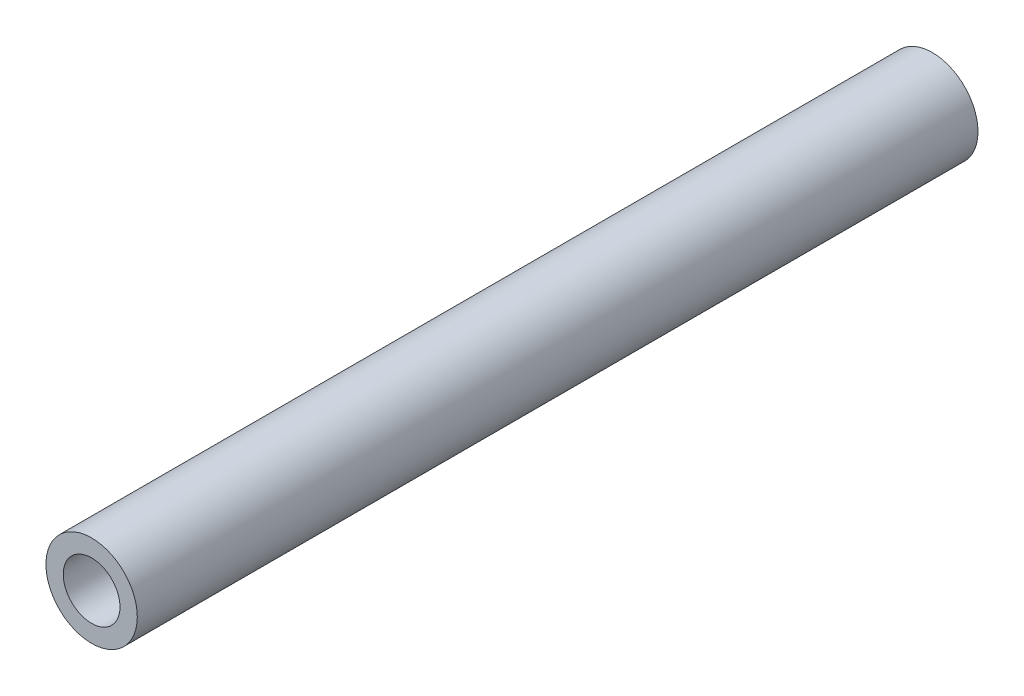
ISO-10303-21;
HEADER;
FILE_DESCRIPTION(('STEP AP214'),'2;1');
FILE_NAME('part.step','',(''),(''),'','','');
FILE_SCHEMA(('AUTOMOTIVE_DESIGN { 1 0 10303 214 1 1 1 1 }'));
ENDSEC;
DATA;
#1=APPLICATION_CONTEXT('core data for automotive mechanical design processes');
#2=APPLICATION_PROTOCOL_DEFINITION('international standard','automotive_design',2000,#1);
#3=PRODUCT_CONTEXT('',#1,'mechanical');
#4=PRODUCT('Part','Part','',(#3));
#5=PRODUCT_RELATED_PRODUCT_CATEGORY('part','',(#4));
#6=PRODUCT_DEFINITION_FORMATION('','',#4);
#7=PRODUCT_DEFINITION_CONTEXT('part definition',#1,'design');
#8=PRODUCT_DEFINITION('design','',#6,#7);
#9=PRODUCT_DEFINITION_SHAPE('','',#8);
#10=(LENGTH_UNIT() NAMED_UNIT(*) SI_UNIT(.MILLI.,.METRE.));
#11=(NAMED_UNIT(*) PLANE_ANGLE_UNIT() SI_UNIT($,.RADIAN.));
#12=(NAMED_UNIT(*) SI_UNIT($,.STERADIAN.) SOLID_ANGLE_UNIT());
#13=UNCERTAINTY_MEASURE_WITH_UNIT(LENGTH_MEASURE(1.E-05),#10,'distance_accuracy_value','');
#14=(GEOMETRIC_REPRESENTATION_CONTEXT(3) GLOBAL_UNCERTAINTY_ASSIGNED_CONTEXT((#13)) GLOBAL_UNIT_ASSIGNED_CONTEXT((#10,
#11,#12)) REPRESENTATION_CONTEXT('',''));
#15=CARTESIAN_POINT('',(0.,0.,0.));
#16=DIRECTION('',(0.,0.,1.));
#17=DIRECTION('',(1.,0.,0.));
#18=AXIS2_PLACEMENT_3D('',#15,#16,#17);
#19=CARTESIAN_POINT('',(0.,0.,73.025));
#20=DIRECTION('',(0.,0.,1.));
#21=DIRECTION('',(1.,0.,0.));
#22=AXIS2_PLACEMENT_3D('',#19,#20,#21);
#23=PLANE('',#22);
#24=CARTESIAN_POINT('',(0.,0.,73.025));
#25=DIRECTION('',(0.,0.,1.));
#26=DIRECTION('',(1.,0.,0.));
#27=AXIS2_PLACEMENT_3D('',#24,#25,#26);
#28=CIRCLE('',#27,3.96875);
#29=CARTESIAN_POINT('',(3.96875,0.,73.025));
#30=VERTEX_POINT('',#29);
#31=EDGE_CURVE('E10',#30,#30,#28,.T.);
#32=ORIENTED_EDGE('',*,*,#31,.T.);
#33=EDGE_LOOP('',(#32));
#34=FACE_BOUND('',#33,.T.);
#35=CARTESIAN_POINT('',(0.,0.,73.025));
#36=DIRECTION('',(0.,0.,1.));
#37=DIRECTION('',(1.,0.,0.));
#38=AXIS2_PLACEMENT_3D('',#35,#36,#37);
#39=CIRCLE('',#38,2.4638);
#40=CARTESIAN_POINT('',(2.4638,0.,73.025));
#41=VERTEX_POINT('',#40);
#42=EDGE_CURVE('E56',#41,#41,#39,.T.);
#43=ORIENTED_EDGE('',*,*,#42,.F.);
#44=EDGE_LOOP('',(#43));
#45=FACE_BOUND('',#44,.T.);
#46=ADVANCED_FACE('F43',(#34,#45),#23,.T.);
#47=CARTESIAN_POINT('',(0.,0.,0.));
#48=DIRECTION('',(0.,0.,1.));
#49=DIRECTION('',(1.,0.,0.));
#50=AXIS2_PLACEMENT_3D('',#47,#48,#49);
#51=PLANE('',#50);
#52=CARTESIAN_POINT('',(0.,0.,0.));
#53=DIRECTION('',(0.,0.,1.));
#54=DIRECTION('',(1.,0.,0.));
#55=AXIS2_PLACEMENT_3D('',#52,#53,#54);
#56=CIRCLE('',#55,3.96875);
#57=CARTESIAN_POINT('',(3.96875,0.,0.));
#58=VERTEX_POINT('',#57);
#59=EDGE_CURVE('E47',#58,#58,#56,.T.);
#60=ORIENTED_EDGE('',*,*,#59,.F.);
#61=EDGE_LOOP('',(#60));
#62=FACE_BOUND('',#61,.T.);
#63=CARTESIAN_POINT('',(0.,0.,0.));
#64=DIRECTION('',(0.,0.,1.));
#65=DIRECTION('',(1.,0.,0.));
#66=AXIS2_PLACEMENT_3D('',#63,#64,#65);
#67=CIRCLE('',#66,2.4638);
#68=CARTESIAN_POINT('',(2.4638,0.,0.));
#69=VERTEX_POINT('',#68);
#70=EDGE_CURVE('E58',#69,#69,#67,.T.);
#71=ORIENTED_EDGE('',*,*,#70,.T.);
#72=EDGE_LOOP('',(#71));
#73=FACE_BOUND('',#72,.T.);
#74=ADVANCED_FACE('F70',(#62,#73),#51,.F.);
#75=CARTESIAN_POINT('',(0.,0.,73.025));
#76=DIRECTION('',(0.,0.,-1.));
#77=DIRECTION('',(-1.,0.,0.));
#78=AXIS2_PLACEMENT_3D('',#75,#76,#77);
#79=CYLINDRICAL_SURFACE('',#78,3.96875);
#80=ORIENTED_EDGE('',*,*,#31,.F.);
#81=EDGE_LOOP('',(#80));
#82=FACE_BOUND('',#81,.T.);
#83=ORIENTED_EDGE('',*,*,#59,.T.);
#84=EDGE_LOOP('',(#83));
#85=FACE_BOUND('',#84,.T.);
#86=ADVANCED_FACE('F45',(#82,#85),#79,.T.);
#87=CARTESIAN_POINT('',(0.,0.,73.025));
#88=DIRECTION('',(0.,0.,-1.));
#89=DIRECTION('',(-1.,0.,0.));
#90=AXIS2_PLACEMENT_3D('',#87,#88,#89);
#91=CYLINDRICAL_SURFACE('',#90,2.4638);
#92=ORIENTED_EDGE('',*,*,#42,.T.);
#93=EDGE_LOOP('',(#92));
#94=FACE_BOUND('',#93,.T.);
#95=ORIENTED_EDGE('',*,*,#70,.F.);
#96=EDGE_LOOP('',(#95));
#97=FACE_BOUND('',#96,.T.);
#98=ADVANCED_FACE('F66',(#94,#97),#91,.F.);
#99=CLOSED_SHELL('',(#46,#74,#86,#98));
#100=MANIFOLD_SOLID_BREP('B2',#99);
#101=ADVANCED_BREP_SHAPE_REPRESENTATION('',(#18,#100),#14);
#102=SHAPE_DEFINITION_REPRESENTATION(#9,#101);
ENDSEC;
END-ISO-10303-21;
